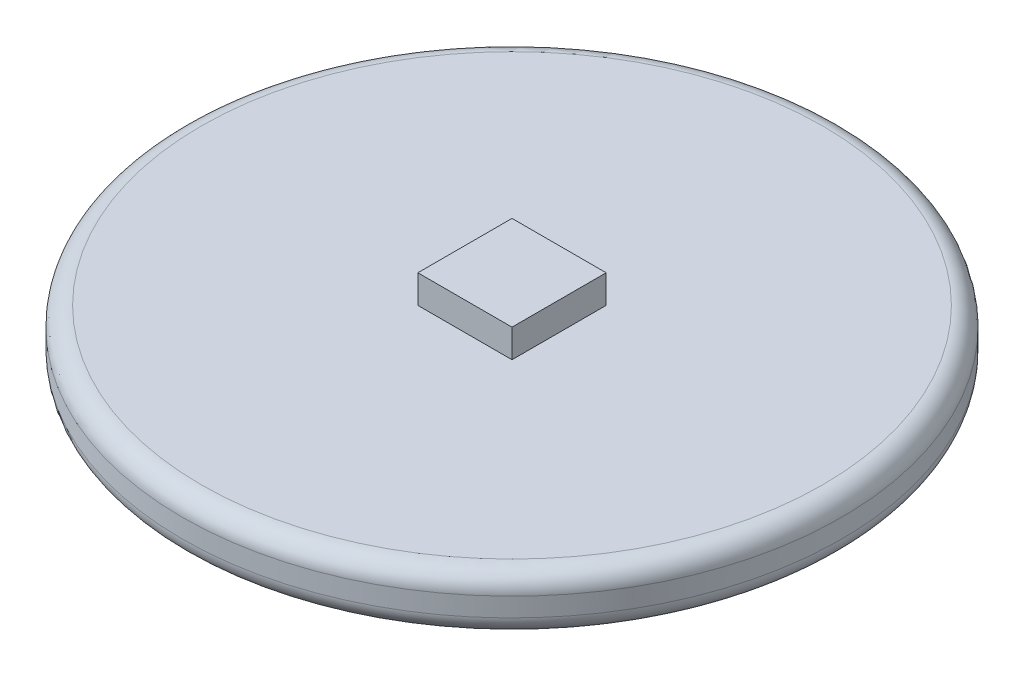
ISO-10303-21;
HEADER;
FILE_DESCRIPTION(('STEP AP214'),'2;1');
FILE_NAME('part.step','',(''),(''),'','','');
FILE_SCHEMA(('AUTOMOTIVE_DESIGN { 1 0 10303 214 1 1 1 1 }'));
ENDSEC;
DATA;
#1=APPLICATION_CONTEXT('core data for automotive mechanical design processes');
#2=APPLICATION_PROTOCOL_DEFINITION('international standard','automotive_design',2000,#1);
#3=PRODUCT_CONTEXT('',#1,'mechanical');
#4=PRODUCT('Part','Part','',(#3));
#5=PRODUCT_RELATED_PRODUCT_CATEGORY('part','',(#4));
#6=PRODUCT_DEFINITION_FORMATION('','',#4);
#7=PRODUCT_DEFINITION_CONTEXT('part definition',#1,'design');
#8=PRODUCT_DEFINITION('design','',#6,#7);
#9=PRODUCT_DEFINITION_SHAPE('','',#8);
#10=(LENGTH_UNIT() NAMED_UNIT(*) SI_UNIT(.MILLI.,.METRE.));
#11=(NAMED_UNIT(*) PLANE_ANGLE_UNIT() SI_UNIT($,.RADIAN.));
#12=(NAMED_UNIT(*) SI_UNIT($,.STERADIAN.) SOLID_ANGLE_UNIT());
#13=UNCERTAINTY_MEASURE_WITH_UNIT(LENGTH_MEASURE(1.E-05),#10,'distance_accuracy_value','');
#14=(GEOMETRIC_REPRESENTATION_CONTEXT(3) GLOBAL_UNCERTAINTY_ASSIGNED_CONTEXT((#13)) GLOBAL_UNIT_ASSIGNED_CONTEXT((#10,
#11,#12)) REPRESENTATION_CONTEXT('',''));
#15=CARTESIAN_POINT('',(0.,0.,0.));
#16=DIRECTION('',(0.,0.,1.));
#17=DIRECTION('',(1.,0.,0.));
#18=AXIS2_PLACEMENT_3D('',#15,#16,#17);
#19=CARTESIAN_POINT('',(0.,6.,0.));
#20=DIRECTION('',(0.,1.,0.));
#21=DIRECTION('',(0.,0.,1.));
#22=AXIS2_PLACEMENT_3D('',#19,#20,#21);
#23=PLANE('',#22);
#24=CARTESIAN_POINT('',(0.,6.,0.));
#25=DIRECTION('',(0.,1.,0.));
#26=DIRECTION('',(0.,0.,1.));
#27=AXIS2_PLACEMENT_3D('',#24,#25,#26);
#28=CIRCLE('',#27,33.);
#29=CARTESIAN_POINT('',(0.,6.,33.));
#30=VERTEX_POINT('',#29);
#31=EDGE_CURVE('E11',#30,#30,#28,.T.);
#32=ORIENTED_EDGE('',*,*,#31,.T.);
#33=EDGE_LOOP('',(#32));
#34=FACE_BOUND('',#33,.T.);
#35=DIRECTION('',(1.,0.,0.));
#36=VECTOR('',#35,1.);
#37=CARTESIAN_POINT('',(5.,6.,5.));
#38=LINE('',#37,#36);
#39=CARTESIAN_POINT('',(-5.,6.,5.));
#40=VERTEX_POINT('',#39);
#41=CARTESIAN_POINT('',(5.,6.,5.));
#42=VERTEX_POINT('',#41);
#43=EDGE_CURVE('E97',#40,#42,#38,.T.);
#44=ORIENTED_EDGE('',*,*,#43,.F.);
#45=DIRECTION('',(0.,0.,1.));
#46=VECTOR('',#45,1.);
#47=CARTESIAN_POINT('',(-5.,6.,5.));
#48=LINE('',#47,#46);
#49=CARTESIAN_POINT('',(-5.,6.,-5.));
#50=VERTEX_POINT('',#49);
#51=EDGE_CURVE('E111',#50,#40,#48,.T.);
#52=ORIENTED_EDGE('',*,*,#51,.F.);
#53=DIRECTION('',(-1.,0.,0.));
#54=VECTOR('',#53,1.);
#55=CARTESIAN_POINT('',(5.,6.,-5.));
#56=LINE('',#55,#54);
#57=CARTESIAN_POINT('',(5.,6.,-5.));
#58=VERTEX_POINT('',#57);
#59=EDGE_CURVE('E77',#58,#50,#56,.T.);
#60=ORIENTED_EDGE('',*,*,#59,.F.);
#61=DIRECTION('',(0.,0.,-1.));
#62=VECTOR('',#61,1.);
#63=CARTESIAN_POINT('',(5.,6.,5.));
#64=LINE('',#63,#62);
#65=EDGE_CURVE('E117',#42,#58,#64,.T.);
#66=ORIENTED_EDGE('',*,*,#65,.F.);
#67=EDGE_LOOP('',(#44,#52,#60,#66));
#68=FACE_BOUND('',#67,.T.);
#69=ADVANCED_FACE('F39',(#34,#68),#23,.T.);
#70=CARTESIAN_POINT('',(0.,6.,0.));
#71=DIRECTION('',(0.,-1.,0.));
#72=DIRECTION('',(0.,0.,-1.));
#73=AXIS2_PLACEMENT_3D('',#70,#71,#72);
#74=CYLINDRICAL_SURFACE('',#73,35.);
#75=CARTESIAN_POINT('',(0.,2.,0.));
#76=DIRECTION('',(0.,1.,0.));
#77=DIRECTION('',(0.,0.,1.));
#78=AXIS2_PLACEMENT_3D('',#75,#76,#77);
#79=CIRCLE('',#78,35.);
#80=CARTESIAN_POINT('',(0.,2.,35.));
#81=VERTEX_POINT('',#80);
#82=EDGE_CURVE('E132',#81,#81,#79,.T.);
#83=ORIENTED_EDGE('',*,*,#82,.T.);
#84=EDGE_LOOP('',(#83));
#85=FACE_BOUND('',#84,.T.);
#86=CARTESIAN_POINT('',(0.,4.,0.));
#87=DIRECTION('',(0.,1.,0.));
#88=DIRECTION('',(0.,0.,1.));
#89=AXIS2_PLACEMENT_3D('',#86,#87,#88);
#90=CIRCLE('',#89,35.);
#91=CARTESIAN_POINT('',(0.,4.,35.));
#92=VERTEX_POINT('',#91);
#93=EDGE_CURVE('E128',#92,#92,#90,.F.);
#94=ORIENTED_EDGE('',*,*,#93,.T.);
#95=EDGE_LOOP('',(#94));
#96=FACE_BOUND('',#95,.T.);
#97=ADVANCED_FACE('F146',(#85,#96),#74,.T.);
#98=CARTESIAN_POINT('',(0.,0.,0.));
#99=DIRECTION('',(0.,1.,0.));
#100=DIRECTION('',(0.,0.,1.));
#101=AXIS2_PLACEMENT_3D('',#98,#99,#100);
#102=PLANE('',#101);
#103=CARTESIAN_POINT('',(0.,0.,0.));
#104=DIRECTION('',(0.,1.,0.));
#105=DIRECTION('',(0.,0.,1.));
#106=AXIS2_PLACEMENT_3D('',#103,#104,#105);
#107=CIRCLE('',#106,33.);
#108=CARTESIAN_POINT('',(0.,0.,33.));
#109=VERTEX_POINT('',#108);
#110=EDGE_CURVE('E48',#109,#109,#107,.F.);
#111=ORIENTED_EDGE('',*,*,#110,.T.);
#112=EDGE_LOOP('',(#111));
#113=FACE_BOUND('',#112,.T.);
#114=ADVANCED_FACE('F139',(#113),#102,.F.);
#115=CARTESIAN_POINT('',(0.,2.,0.));
#116=DIRECTION('',(0.,1.,0.));
#117=DIRECTION('',(0.,0.,1.));
#118=AXIS2_PLACEMENT_3D('',#115,#116,#117);
#119=TOROIDAL_SURFACE('',#118,33.,2.);
#120=ORIENTED_EDGE('',*,*,#110,.F.);
#121=EDGE_LOOP('',(#120));
#122=FACE_BOUND('',#121,.T.);
#123=ORIENTED_EDGE('',*,*,#82,.F.);
#124=EDGE_LOOP('',(#123));
#125=FACE_BOUND('',#124,.T.);
#126=ADVANCED_FACE('F141',(#122,#125),#119,.T.);
#127=CARTESIAN_POINT('',(0.,4.,0.));
#128=DIRECTION('',(0.,1.,0.));
#129=DIRECTION('',(0.,0.,1.));
#130=AXIS2_PLACEMENT_3D('',#127,#128,#129);
#131=TOROIDAL_SURFACE('',#130,33.,2.);
#132=ORIENTED_EDGE('',*,*,#93,.F.);
#133=EDGE_LOOP('',(#132));
#134=FACE_BOUND('',#133,.T.);
#135=ORIENTED_EDGE('',*,*,#31,.F.);
#136=EDGE_LOOP('',(#135));
#137=FACE_BOUND('',#136,.T.);
#138=ADVANCED_FACE('F41',(#134,#137),#131,.T.);
#139=CARTESIAN_POINT('',(-5.,9.,5.));
#140=DIRECTION('',(1.,0.,0.));
#141=DIRECTION('',(0.,0.,-1.));
#142=AXIS2_PLACEMENT_3D('',#139,#140,#141);
#143=PLANE('',#142);
#144=ORIENTED_EDGE('',*,*,#51,.T.);
#145=DIRECTION('',(0.,-1.,0.));
#146=VECTOR('',#145,1.);
#147=CARTESIAN_POINT('',(-5.,9.,5.));
#148=LINE('',#147,#146);
#149=CARTESIAN_POINT('',(-5.,9.,5.));
#150=VERTEX_POINT('',#149);
#151=EDGE_CURVE('E101',#150,#40,#148,.T.);
#152=ORIENTED_EDGE('',*,*,#151,.F.);
#153=DIRECTION('',(0.,0.,1.));
#154=VECTOR('',#153,1.);
#155=CARTESIAN_POINT('',(-5.,9.,5.));
#156=LINE('',#155,#154);
#157=CARTESIAN_POINT('',(-5.,9.,-5.));
#158=VERTEX_POINT('',#157);
#159=EDGE_CURVE('E89',#158,#150,#156,.T.);
#160=ORIENTED_EDGE('',*,*,#159,.F.);
#161=DIRECTION('',(0.,-1.,0.));
#162=VECTOR('',#161,1.);
#163=CARTESIAN_POINT('',(-5.,9.,-5.));
#164=LINE('',#163,#162);
#165=EDGE_CURVE('E107',#158,#50,#164,.T.);
#166=ORIENTED_EDGE('',*,*,#165,.T.);
#167=EDGE_LOOP('',(#144,#152,#160,#166));
#168=FACE_BOUND('',#167,.T.);
#169=ADVANCED_FACE('F154',(#168),#143,.F.);
#170=CARTESIAN_POINT('',(5.,9.,5.));
#171=DIRECTION('',(0.,0.,-1.));
#172=DIRECTION('',(-1.,0.,0.));
#173=AXIS2_PLACEMENT_3D('',#170,#171,#172);
#174=PLANE('',#173);
#175=ORIENTED_EDGE('',*,*,#43,.T.);
#176=DIRECTION('',(0.,-1.,0.));
#177=VECTOR('',#176,1.);
#178=CARTESIAN_POINT('',(5.,9.,5.));
#179=LINE('',#178,#177);
#180=CARTESIAN_POINT('',(5.,9.,5.));
#181=VERTEX_POINT('',#180);
#182=EDGE_CURVE('E94',#181,#42,#179,.T.);
#183=ORIENTED_EDGE('',*,*,#182,.F.);
#184=DIRECTION('',(1.,0.,0.));
#185=VECTOR('',#184,1.);
#186=CARTESIAN_POINT('',(5.,9.,5.));
#187=LINE('',#186,#185);
#188=EDGE_CURVE('E84',#150,#181,#187,.T.);
#189=ORIENTED_EDGE('',*,*,#188,.F.);
#190=ORIENTED_EDGE('',*,*,#151,.T.);
#191=EDGE_LOOP('',(#175,#183,#189,#190));
#192=FACE_BOUND('',#191,.T.);
#193=ADVANCED_FACE('F95',(#192),#174,.F.);
#194=CARTESIAN_POINT('',(5.,9.,5.));
#195=DIRECTION('',(-1.,0.,0.));
#196=DIRECTION('',(0.,0.,1.));
#197=AXIS2_PLACEMENT_3D('',#194,#195,#196);
#198=PLANE('',#197);
#199=ORIENTED_EDGE('',*,*,#65,.T.);
#200=DIRECTION('',(0.,-1.,0.));
#201=VECTOR('',#200,1.);
#202=CARTESIAN_POINT('',(5.,9.,-5.));
#203=LINE('',#202,#201);
#204=CARTESIAN_POINT('',(5.,9.,-5.));
#205=VERTEX_POINT('',#204);
#206=EDGE_CURVE('E55',#205,#58,#203,.T.);
#207=ORIENTED_EDGE('',*,*,#206,.F.);
#208=DIRECTION('',(0.,0.,-1.));
#209=VECTOR('',#208,1.);
#210=CARTESIAN_POINT('',(5.,9.,5.));
#211=LINE('',#210,#209);
#212=EDGE_CURVE('E87',#181,#205,#211,.T.);
#213=ORIENTED_EDGE('',*,*,#212,.F.);
#214=ORIENTED_EDGE('',*,*,#182,.T.);
#215=EDGE_LOOP('',(#199,#207,#213,#214));
#216=FACE_BOUND('',#215,.T.);
#217=ADVANCED_FACE('F103',(#216),#198,.F.);
#218=CARTESIAN_POINT('',(5.,9.,-5.));
#219=DIRECTION('',(0.,0.,1.));
#220=DIRECTION('',(1.,0.,0.));
#221=AXIS2_PLACEMENT_3D('',#218,#219,#220);
#222=PLANE('',#221);
#223=ORIENTED_EDGE('',*,*,#59,.T.);
#224=ORIENTED_EDGE('',*,*,#165,.F.);
#225=DIRECTION('',(-1.,0.,0.));
#226=VECTOR('',#225,1.);
#227=CARTESIAN_POINT('',(5.,9.,-5.));
#228=LINE('',#227,#226);
#229=EDGE_CURVE('E63',#205,#158,#228,.T.);
#230=ORIENTED_EDGE('',*,*,#229,.F.);
#231=ORIENTED_EDGE('',*,*,#206,.T.);
#232=EDGE_LOOP('',(#223,#224,#230,#231));
#233=FACE_BOUND('',#232,.T.);
#234=ADVANCED_FACE('F162',(#233),#222,.F.);
#235=CARTESIAN_POINT('',(0.,9.,0.));
#236=DIRECTION('',(0.,1.,0.));
#237=DIRECTION('',(0.,0.,1.));
#238=AXIS2_PLACEMENT_3D('',#235,#236,#237);
#239=PLANE('',#238);
#240=ORIENTED_EDGE('',*,*,#159,.T.);
#241=ORIENTED_EDGE('',*,*,#188,.T.);
#242=ORIENTED_EDGE('',*,*,#212,.T.);
#243=ORIENTED_EDGE('',*,*,#229,.T.);
#244=EDGE_LOOP('',(#240,#241,#242,#243));
#245=FACE_BOUND('',#244,.T.);
#246=ADVANCED_FACE('F85',(#245),#239,.T.);
#247=CLOSED_SHELL('',(#69,#97,#114,#126,#138,#169,#193,#217,#234,#246));
#248=MANIFOLD_SOLID_BREP('B2',#247);
#249=ADVANCED_BREP_SHAPE_REPRESENTATION('',(#18,#248),#14);
#250=SHAPE_DEFINITION_REPRESENTATION(#9,#249);
ENDSEC;
END-ISO-10303-21;
